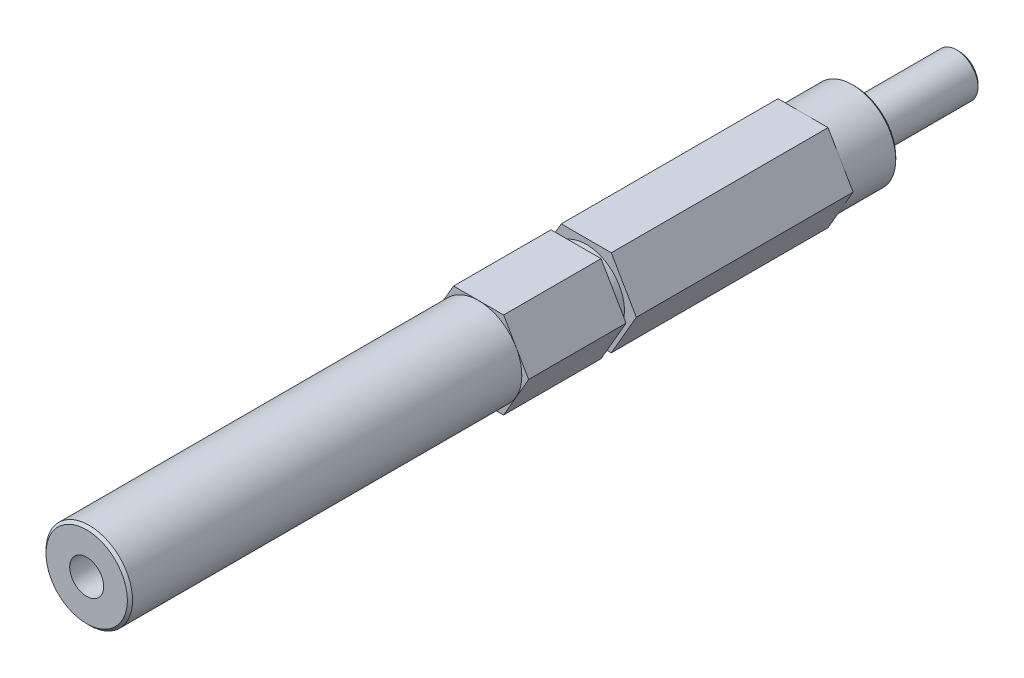
ISO-10303-21;
HEADER;
FILE_DESCRIPTION(('STEP AP214'),'2;1');
FILE_NAME('part.step','',(''),(''),'','','');
FILE_SCHEMA(('AUTOMOTIVE_DESIGN { 1 0 10303 214 1 1 1 1 }'));
ENDSEC;
DATA;
#1=APPLICATION_CONTEXT('core data for automotive mechanical design processes');
#2=APPLICATION_PROTOCOL_DEFINITION('international standard','automotive_design',2000,#1);
#3=PRODUCT_CONTEXT('',#1,'mechanical');
#4=PRODUCT('Part','Part','',(#3));
#5=PRODUCT_RELATED_PRODUCT_CATEGORY('part','',(#4));
#6=PRODUCT_DEFINITION_FORMATION('','',#4);
#7=PRODUCT_DEFINITION_CONTEXT('part definition',#1,'design');
#8=PRODUCT_DEFINITION('design','',#6,#7);
#9=PRODUCT_DEFINITION_SHAPE('','',#8);
#10=(LENGTH_UNIT() NAMED_UNIT(*) SI_UNIT(.MILLI.,.METRE.));
#11=(NAMED_UNIT(*) PLANE_ANGLE_UNIT() SI_UNIT($,.RADIAN.));
#12=(NAMED_UNIT(*) SI_UNIT($,.STERADIAN.) SOLID_ANGLE_UNIT());
#13=UNCERTAINTY_MEASURE_WITH_UNIT(LENGTH_MEASURE(1.E-05),#10,'distance_accuracy_value','');
#14=(GEOMETRIC_REPRESENTATION_CONTEXT(3) GLOBAL_UNCERTAINTY_ASSIGNED_CONTEXT((#13)) GLOBAL_UNIT_ASSIGNED_CONTEXT((#10,
#11,#12)) REPRESENTATION_CONTEXT('',''));
#15=CARTESIAN_POINT('',(0.,0.,0.));
#16=DIRECTION('',(0.,0.,1.));
#17=DIRECTION('',(1.,0.,0.));
#18=AXIS2_PLACEMENT_3D('',#15,#16,#17);
#19=CARTESIAN_POINT('',(9.05330995064486,0.,-22.86));
#20=DIRECTION('',(0.,0.,1.));
#21=DIRECTION('',(1.,0.,0.));
#22=AXIS2_PLACEMENT_3D('',#19,#20,#21);
#23=PLANE('',#22);
#24=CARTESIAN_POINT('',(9.05330995064486,0.,-22.860000000037));
#25=DIRECTION('',(0.,0.,1.));
#26=DIRECTION('',(1.,0.,0.));
#27=AXIS2_PLACEMENT_3D('',#24,#25,#26);
#28=CIRCLE('',#27,2.76859999993877);
#29=CARTESIAN_POINT('',(11.8219099505836,0.,-22.860000000037));
#30=VERTEX_POINT('',#29);
#31=EDGE_CURVE('E20',#30,#30,#28,.T.);
#32=ORIENTED_EDGE('',*,*,#31,.F.);
#33=EDGE_LOOP('',(#32));
#34=FACE_BOUND('',#33,.T.);
#35=ADVANCED_FACE('F17',(#34),#23,.F.);
#36=CARTESIAN_POINT('',(9.05330995064486,0.,-22.4790000000326));
#37=DIRECTION('',(0.,0.,1.));
#38=DIRECTION('',(1.,0.,0.));
#39=AXIS2_PLACEMENT_3D('',#36,#37,#38);
#40=CONICAL_SURFACE('',#39,3.14959999994318,0.785398163397448);
#41=CARTESIAN_POINT('',(9.05330995064486,0.,-22.479));
#42=DIRECTION('',(0.,0.,-1.));
#43=DIRECTION('',(-1.,0.,0.));
#44=AXIS2_PLACEMENT_3D('',#41,#42,#43);
#45=CIRCLE('',#44,3.1496);
#46=CARTESIAN_POINT('',(5.90370995064486,0.,-22.479));
#47=VERTEX_POINT('',#46);
#48=EDGE_CURVE('E159',#47,#47,#45,.F.);
#49=ORIENTED_EDGE('',*,*,#48,.F.);
#50=EDGE_LOOP('',(#49));
#51=FACE_BOUND('',#50,.T.);
#52=ORIENTED_EDGE('',*,*,#31,.T.);
#53=EDGE_LOOP('',(#52));
#54=FACE_BOUND('',#53,.T.);
#55=ADVANCED_FACE('F353',(#51,#54),#40,.T.);
#56=CARTESIAN_POINT('',(9.05330995064486,0.,-22.86));
#57=DIRECTION('',(0.,0.,-1.));
#58=DIRECTION('',(-1.,0.,0.));
#59=AXIS2_PLACEMENT_3D('',#56,#57,#58);
#60=CYLINDRICAL_SURFACE('',#59,3.1496);
#61=CARTESIAN_POINT('',(9.05330995064486,0.,-7.62));
#62=DIRECTION('',(0.,0.,-1.));
#63=DIRECTION('',(-1.,0.,0.));
#64=AXIS2_PLACEMENT_3D('',#61,#62,#63);
#65=CIRCLE('',#64,3.1496);
#66=CARTESIAN_POINT('',(5.90370995064486,0.,-7.62));
#67=VERTEX_POINT('',#66);
#68=EDGE_CURVE('E162',#67,#67,#65,.T.);
#69=ORIENTED_EDGE('',*,*,#68,.T.);
#70=EDGE_LOOP('',(#69));
#71=FACE_BOUND('',#70,.T.);
#72=ORIENTED_EDGE('',*,*,#48,.T.);
#73=EDGE_LOOP('',(#72));
#74=FACE_BOUND('',#73,.T.);
#75=ADVANCED_FACE('F338',(#71,#74),#60,.T.);
#76=CARTESIAN_POINT('',(9.05330995064486,0.,-7.62));
#77=DIRECTION('',(0.,0.,1.));
#78=DIRECTION('',(1.,0.,0.));
#79=AXIS2_PLACEMENT_3D('',#76,#77,#78);
#80=PLANE('',#79);
#81=CARTESIAN_POINT('',(9.05330995064486,0.,-7.61999999997443));
#82=DIRECTION('',(0.,0.,1.));
#83=DIRECTION('',(1.,0.,0.));
#84=AXIS2_PLACEMENT_3D('',#81,#82,#83);
#85=CIRCLE('',#84,5.96264999998613);
#86=CARTESIAN_POINT('',(15.015959950631,0.,-7.61999999997443));
#87=VERTEX_POINT('',#86);
#88=EDGE_CURVE('E156',#87,#87,#85,.T.);
#89=ORIENTED_EDGE('',*,*,#88,.F.);
#90=EDGE_LOOP('',(#89));
#91=FACE_BOUND('',#90,.T.);
#92=ORIENTED_EDGE('',*,*,#68,.F.);
#93=EDGE_LOOP('',(#92));
#94=FACE_BOUND('',#93,.T.);
#95=ADVANCED_FACE('F341',(#91,#94),#80,.F.);
#96=CARTESIAN_POINT('',(9.05330995064486,0.,-7.23899999997002));
#97=DIRECTION('',(0.,0.,1.));
#98=DIRECTION('',(1.,0.,0.));
#99=AXIS2_PLACEMENT_3D('',#96,#97,#98);
#100=CONICAL_SURFACE('',#99,6.34364999999053,0.785398163397448);
#101=CARTESIAN_POINT('',(9.05330995064486,0.,-7.239));
#102=DIRECTION('',(0.,0.,-1.));
#103=DIRECTION('',(-1.,0.,0.));
#104=AXIS2_PLACEMENT_3D('',#101,#102,#103);
#105=CIRCLE('',#104,6.34365);
#106=CARTESIAN_POINT('',(2.70965995064486,0.,-7.239));
#107=VERTEX_POINT('',#106);
#108=EDGE_CURVE('E153',#107,#107,#105,.F.);
#109=ORIENTED_EDGE('',*,*,#108,.F.);
#110=EDGE_LOOP('',(#109));
#111=FACE_BOUND('',#110,.T.);
#112=ORIENTED_EDGE('',*,*,#88,.T.);
#113=EDGE_LOOP('',(#112));
#114=FACE_BOUND('',#113,.T.);
#115=ADVANCED_FACE('F343',(#111,#114),#100,.T.);
#116=CARTESIAN_POINT('',(9.05330995064486,0.,-7.62));
#117=DIRECTION('',(0.,0.,-1.));
#118=DIRECTION('',(-1.,0.,0.));
#119=AXIS2_PLACEMENT_3D('',#116,#117,#118);
#120=CYLINDRICAL_SURFACE('',#119,6.34365);
#121=CARTESIAN_POINT('',(9.05330995064486,0.,0.));
#122=DIRECTION('',(0.,0.,-1.));
#123=DIRECTION('',(-1.,0.,0.));
#124=AXIS2_PLACEMENT_3D('',#121,#122,#123);
#125=CIRCLE('',#124,6.34365);
#126=CARTESIAN_POINT('',(2.70965995064486,0.,0.));
#127=VERTEX_POINT('',#126);
#128=EDGE_CURVE('E135',#127,#127,#125,.T.);
#129=ORIENTED_EDGE('',*,*,#128,.T.);
#130=EDGE_LOOP('',(#129));
#131=FACE_BOUND('',#130,.T.);
#132=ORIENTED_EDGE('',*,*,#108,.T.);
#133=EDGE_LOOP('',(#132));
#134=FACE_BOUND('',#133,.T.);
#135=ADVANCED_FACE('F350',(#131,#134),#120,.T.);
#136=CARTESIAN_POINT('',(12.719484159999,6.35,0.));
#137=DIRECTION('',(0.,0.,1.));
#138=DIRECTION('',(1.,0.,0.));
#139=AXIS2_PLACEMENT_3D('',#136,#137,#138);
#140=PLANE('',#139);
#141=DIRECTION('',(-0.499999999999999,-0.866025403784439,0.));
#142=VECTOR('',#141,1.);
#143=CARTESIAN_POINT('',(12.719484159999,-6.35000000000001,0.));
#144=LINE('',#143,#142);
#145=CARTESIAN_POINT('',(16.3856583693531,0.,0.));
#146=VERTEX_POINT('',#145);
#147=CARTESIAN_POINT('',(12.719484159999,-6.35000000000001,0.));
#148=VERTEX_POINT('',#147);
#149=EDGE_CURVE('E124',#146,#148,#144,.T.);
#150=ORIENTED_EDGE('',*,*,#149,.T.);
#151=DIRECTION('',(1.,0.,0.));
#152=VECTOR('',#151,1.);
#153=CARTESIAN_POINT('',(5.38713574129074,-6.35000000000001,0.));
#154=LINE('',#153,#152);
#155=CARTESIAN_POINT('',(5.38713574129074,-6.35000000000001,0.));
#156=VERTEX_POINT('',#155);
#157=EDGE_CURVE('E144',#148,#156,#154,.F.);
#158=ORIENTED_EDGE('',*,*,#157,.T.);
#159=DIRECTION('',(-0.499999999999999,0.866025403784439,0.));
#160=VECTOR('',#159,1.);
#161=CARTESIAN_POINT('',(1.72096153193662,0.,0.));
#162=LINE('',#161,#160);
#163=CARTESIAN_POINT('',(1.72096153193662,0.,0.));
#164=VERTEX_POINT('',#163);
#165=EDGE_CURVE('E297',#156,#164,#162,.T.);
#166=ORIENTED_EDGE('',*,*,#165,.T.);
#167=DIRECTION('',(0.499999999999999,0.866025403784439,0.));
#168=VECTOR('',#167,1.);
#169=CARTESIAN_POINT('',(5.38713574129074,6.34999999999999,0.));
#170=LINE('',#169,#168);
#171=CARTESIAN_POINT('',(5.38713574129074,6.35,0.));
#172=VERTEX_POINT('',#171);
#173=EDGE_CURVE('E292',#164,#172,#170,.T.);
#174=ORIENTED_EDGE('',*,*,#173,.T.);
#175=DIRECTION('',(1.,0.,0.));
#176=VECTOR('',#175,1.);
#177=CARTESIAN_POINT('',(12.719484159999,6.35,0.));
#178=LINE('',#177,#176);
#179=CARTESIAN_POINT('',(12.719484159999,6.35,0.));
#180=VERTEX_POINT('',#179);
#181=EDGE_CURVE('E132',#172,#180,#178,.T.);
#182=ORIENTED_EDGE('',*,*,#181,.T.);
#183=DIRECTION('',(0.499999999999999,-0.866025403784439,0.));
#184=VECTOR('',#183,1.);
#185=CARTESIAN_POINT('',(16.3856583693531,0.,0.));
#186=LINE('',#185,#184);
#187=EDGE_CURVE('E127',#180,#146,#186,.T.);
#188=ORIENTED_EDGE('',*,*,#187,.T.);
#189=EDGE_LOOP('',(#150,#158,#166,#174,#182,#188));
#190=FACE_BOUND('',#189,.T.);
#191=ORIENTED_EDGE('',*,*,#128,.F.);
#192=EDGE_LOOP('',(#191));
#193=FACE_BOUND('',#192,.T.);
#194=ADVANCED_FACE('F129',(#190,#193),#140,.F.);
#195=CARTESIAN_POINT('',(16.3856583693531,0.,47.5234));
#196=DIRECTION('',(-0.866025403784439,-0.499999999999999,0.));
#197=DIRECTION('',(0.499999999999999,-0.866025403784439,0.));
#198=AXIS2_PLACEMENT_3D('',#195,#196,#197);
#199=PLANE('',#198);
#200=DIRECTION('',(0.499999999999998,-0.86602540378444,0.));
#201=VECTOR('',#200,1.);
#202=CARTESIAN_POINT('',(12.719484159999,6.35,31.75));
#203=LINE('',#202,#201);
#204=CARTESIAN_POINT('',(12.719484159999,6.34999999999999,31.75));
#205=VERTEX_POINT('',#204);
#206=CARTESIAN_POINT('',(16.3856583693531,0.,31.75));
#207=VERTEX_POINT('',#206);
#208=EDGE_CURVE('E141',#205,#207,#203,.T.);
#209=ORIENTED_EDGE('',*,*,#208,.T.);
#210=DIRECTION('',(0.,0.,1.));
#211=VECTOR('',#210,1.);
#212=CARTESIAN_POINT('',(16.3856583693531,0.,47.5234));
#213=LINE('',#212,#211);
#214=EDGE_CURVE('E138',#207,#146,#213,.F.);
#215=ORIENTED_EDGE('',*,*,#214,.T.);
#216=ORIENTED_EDGE('',*,*,#187,.F.);
#217=DIRECTION('',(0.,0.,1.));
#218=VECTOR('',#217,1.);
#219=CARTESIAN_POINT('',(12.719484159999,6.35,47.5234));
#220=LINE('',#219,#218);
#221=EDGE_CURVE('E286',#180,#205,#220,.T.);
#222=ORIENTED_EDGE('',*,*,#221,.T.);
#223=EDGE_LOOP('',(#209,#215,#216,#222));
#224=FACE_BOUND('',#223,.T.);
#225=ADVANCED_FACE('F139',(#224),#199,.F.);
#226=CARTESIAN_POINT('',(12.719484159999,-6.35000000000001,47.5234));
#227=DIRECTION('',(-0.866025403784439,0.499999999999999,0.));
#228=DIRECTION('',(-0.499999999999999,-0.866025403784439,0.));
#229=AXIS2_PLACEMENT_3D('',#226,#227,#228);
#230=PLANE('',#229);
#231=DIRECTION('',(-0.499999999999996,-0.86602540378444,0.));
#232=VECTOR('',#231,1.);
#233=CARTESIAN_POINT('',(16.3856583693531,0.,31.75));
#234=LINE('',#233,#232);
#235=CARTESIAN_POINT('',(12.719484159999,-6.35000000000001,31.75));
#236=VERTEX_POINT('',#235);
#237=EDGE_CURVE('E280',#207,#236,#234,.T.);
#238=ORIENTED_EDGE('',*,*,#237,.T.);
#239=DIRECTION('',(0.,0.,1.));
#240=VECTOR('',#239,1.);
#241=CARTESIAN_POINT('',(12.719484159999,-6.35000000000001,47.5234));
#242=LINE('',#241,#240);
#243=EDGE_CURVE('E148',#236,#148,#242,.F.);
#244=ORIENTED_EDGE('',*,*,#243,.T.);
#245=ORIENTED_EDGE('',*,*,#149,.F.);
#246=ORIENTED_EDGE('',*,*,#214,.F.);
#247=EDGE_LOOP('',(#238,#244,#245,#246));
#248=FACE_BOUND('',#247,.T.);
#249=ADVANCED_FACE('F146',(#248),#230,.F.);
#250=CARTESIAN_POINT('',(5.38713574129074,-6.35000000000001,47.5234));
#251=DIRECTION('',(0.,1.,0.));
#252=DIRECTION('',(0.,0.,1.));
#253=AXIS2_PLACEMENT_3D('',#250,#251,#252);
#254=PLANE('',#253);
#255=DIRECTION('',(-1.,0.,0.));
#256=VECTOR('',#255,1.);
#257=CARTESIAN_POINT('',(40.0413099506449,-6.35000000000001,31.75));
#258=LINE('',#257,#256);
#259=CARTESIAN_POINT('',(5.38713574129074,-6.35000000000001,31.75));
#260=VERTEX_POINT('',#259);
#261=EDGE_CURVE('E278',#236,#260,#258,.T.);
#262=ORIENTED_EDGE('',*,*,#261,.T.);
#263=DIRECTION('',(0.,0.,1.));
#264=VECTOR('',#263,1.);
#265=CARTESIAN_POINT('',(5.38713574129074,-6.35000000000001,47.5234));
#266=LINE('',#265,#264);
#267=EDGE_CURVE('E294',#260,#156,#266,.F.);
#268=ORIENTED_EDGE('',*,*,#267,.T.);
#269=ORIENTED_EDGE('',*,*,#157,.F.);
#270=ORIENTED_EDGE('',*,*,#243,.F.);
#271=EDGE_LOOP('',(#262,#268,#269,#270));
#272=FACE_BOUND('',#271,.T.);
#273=ADVANCED_FACE('F302',(#272),#254,.F.);
#274=CARTESIAN_POINT('',(1.72096153193662,0.,47.5234));
#275=DIRECTION('',(0.866025403784439,0.499999999999999,0.));
#276=DIRECTION('',(-0.499999999999999,0.866025403784439,0.));
#277=AXIS2_PLACEMENT_3D('',#274,#275,#276);
#278=PLANE('',#277);
#279=DIRECTION('',(-0.499999999999999,0.866025403784439,0.));
#280=VECTOR('',#279,1.);
#281=CARTESIAN_POINT('',(5.38713574129074,-6.35000000000001,31.75));
#282=LINE('',#281,#280);
#283=CARTESIAN_POINT('',(1.72096153193662,0.,31.75));
#284=VERTEX_POINT('',#283);
#285=EDGE_CURVE('E276',#260,#284,#282,.T.);
#286=ORIENTED_EDGE('',*,*,#285,.T.);
#287=DIRECTION('',(0.,0.,1.));
#288=VECTOR('',#287,1.);
#289=CARTESIAN_POINT('',(1.72096153193662,0.,47.5234));
#290=LINE('',#289,#288);
#291=EDGE_CURVE('E289',#284,#164,#290,.F.);
#292=ORIENTED_EDGE('',*,*,#291,.T.);
#293=ORIENTED_EDGE('',*,*,#165,.F.);
#294=ORIENTED_EDGE('',*,*,#267,.F.);
#295=EDGE_LOOP('',(#286,#292,#293,#294));
#296=FACE_BOUND('',#295,.T.);
#297=ADVANCED_FACE('F306',(#296),#278,.F.);
#298=CARTESIAN_POINT('',(5.38713574129074,6.34999999999999,47.5234));
#299=DIRECTION('',(0.866025403784439,-0.499999999999999,0.));
#300=DIRECTION('',(0.499999999999999,0.866025403784439,0.));
#301=AXIS2_PLACEMENT_3D('',#298,#299,#300);
#302=PLANE('',#301);
#303=DIRECTION('',(0.5,0.866025403784439,0.));
#304=VECTOR('',#303,1.);
#305=CARTESIAN_POINT('',(1.72096153193662,0.,31.75));
#306=LINE('',#305,#304);
#307=CARTESIAN_POINT('',(5.38713574129074,6.34999999999999,31.75));
#308=VERTEX_POINT('',#307);
#309=EDGE_CURVE('E274',#284,#308,#306,.T.);
#310=ORIENTED_EDGE('',*,*,#309,.T.);
#311=DIRECTION('',(0.,0.,1.));
#312=VECTOR('',#311,1.);
#313=CARTESIAN_POINT('',(5.38713574129074,6.35,47.5234));
#314=LINE('',#313,#312);
#315=EDGE_CURVE('E283',#308,#172,#314,.F.);
#316=ORIENTED_EDGE('',*,*,#315,.T.);
#317=ORIENTED_EDGE('',*,*,#173,.F.);
#318=ORIENTED_EDGE('',*,*,#291,.F.);
#319=EDGE_LOOP('',(#310,#316,#317,#318));
#320=FACE_BOUND('',#319,.T.);
#321=ADVANCED_FACE('F311',(#320),#302,.F.);
#322=CARTESIAN_POINT('',(12.719484159999,6.35,47.5234));
#323=DIRECTION('',(0.,-1.,0.));
#324=DIRECTION('',(1.,0.,0.));
#325=AXIS2_PLACEMENT_3D('',#322,#323,#324);
#326=PLANE('',#325);
#327=DIRECTION('',(-1.,0.,0.));
#328=VECTOR('',#327,1.);
#329=CARTESIAN_POINT('',(40.0413099506449,6.34999999999999,31.75));
#330=LINE('',#329,#328);
#331=EDGE_CURVE('E270',#308,#205,#330,.F.);
#332=ORIENTED_EDGE('',*,*,#331,.T.);
#333=ORIENTED_EDGE('',*,*,#221,.F.);
#334=ORIENTED_EDGE('',*,*,#181,.F.);
#335=ORIENTED_EDGE('',*,*,#315,.F.);
#336=EDGE_LOOP('',(#332,#333,#334,#335));
#337=FACE_BOUND('',#336,.T.);
#338=ADVANCED_FACE('F315',(#337),#326,.F.);
#339=CARTESIAN_POINT('',(40.0413099506449,0.,31.75));
#340=DIRECTION('',(0.,0.,-1.));
#341=DIRECTION('',(-1.,0.,0.));
#342=AXIS2_PLACEMENT_3D('',#339,#340,#341);
#343=PLANE('',#342);
#344=ORIENTED_EDGE('',*,*,#309,.F.);
#345=ORIENTED_EDGE('',*,*,#285,.F.);
#346=ORIENTED_EDGE('',*,*,#261,.F.);
#347=ORIENTED_EDGE('',*,*,#237,.F.);
#348=ORIENTED_EDGE('',*,*,#208,.F.);
#349=ORIENTED_EDGE('',*,*,#331,.F.);
#350=EDGE_LOOP('',(#344,#345,#346,#347,#348,#349));
#351=FACE_BOUND('',#350,.T.);
#352=CARTESIAN_POINT('',(9.05330995064486,0.,31.75));
#353=DIRECTION('',(0.,0.,-1.));
#354=DIRECTION('',(-1.,0.,0.));
#355=AXIS2_PLACEMENT_3D('',#352,#353,#354);
#356=CIRCLE('',#355,5.588);
#357=CARTESIAN_POINT('',(3.46530995064486,0.,31.75));
#358=VERTEX_POINT('',#357);
#359=EDGE_CURVE('E273',#358,#358,#356,.F.);
#360=ORIENTED_EDGE('',*,*,#359,.F.);
#361=EDGE_LOOP('',(#360));
#362=FACE_BOUND('',#361,.T.);
#363=ADVANCED_FACE('F317',(#351,#362),#343,.F.);
#364=CARTESIAN_POINT('',(9.05330995064486,0.,89.0524));
#365=DIRECTION('',(0.,0.,-1.));
#366=DIRECTION('',(-1.,0.,0.));
#367=AXIS2_PLACEMENT_3D('',#364,#365,#366);
#368=PLANE('',#367);
#369=CARTESIAN_POINT('',(9.05330995064486,0.,89.0524));
#370=DIRECTION('',(0.,0.,1.));
#371=DIRECTION('',(1.,0.,0.));
#372=AXIS2_PLACEMENT_3D('',#369,#370,#371);
#373=CIRCLE('',#372,2.48793);
#374=CARTESIAN_POINT('',(11.5412399506449,0.,89.0524));
#375=VERTEX_POINT('',#374);
#376=EDGE_CURVE('E325',#375,#375,#373,.T.);
#377=ORIENTED_EDGE('',*,*,#376,.T.);
#378=EDGE_LOOP('',(#377));
#379=FACE_BOUND('',#378,.T.);
#380=ADVANCED_FACE('F320',(#379),#368,.F.);
#381=CARTESIAN_POINT('',(9.05330995064486,0.,-7.62));
#382=DIRECTION('',(0.,0.,-1.));
#383=DIRECTION('',(-1.,0.,0.));
#384=AXIS2_PLACEMENT_3D('',#381,#382,#383);
#385=CYLINDRICAL_SURFACE('',#384,5.588);
#386=ORIENTED_EDGE('',*,*,#359,.T.);
#387=EDGE_LOOP('',(#386));
#388=FACE_BOUND('',#387,.T.);
#389=CARTESIAN_POINT('',(9.05330995064486,0.,33.2486));
#390=DIRECTION('',(0.,0.,-1.));
#391=DIRECTION('',(-1.,0.,0.));
#392=AXIS2_PLACEMENT_3D('',#389,#390,#391);
#393=CIRCLE('',#392,5.588);
#394=CARTESIAN_POINT('',(3.46530995064486,0.,33.2486));
#395=VERTEX_POINT('',#394);
#396=EDGE_CURVE('E328',#395,#395,#393,.T.);
#397=ORIENTED_EDGE('',*,*,#396,.T.);
#398=EDGE_LOOP('',(#397));
#399=FACE_BOUND('',#398,.T.);
#400=ADVANCED_FACE('F445',(#388,#399),#385,.T.);
#401=CARTESIAN_POINT('',(9.05330995064486,0.,104.9274));
#402=DIRECTION('',(0.,0.,1.));
#403=DIRECTION('',(1.,0.,0.));
#404=AXIS2_PLACEMENT_3D('',#401,#402,#403);
#405=CYLINDRICAL_SURFACE('',#404,2.48793);
#406=CARTESIAN_POINT('',(9.05330995064486,0.,104.9274));
#407=DIRECTION('',(0.,0.,1.));
#408=DIRECTION('',(1.,0.,0.));
#409=AXIS2_PLACEMENT_3D('',#406,#407,#408);
#410=CIRCLE('',#409,2.48793);
#411=CARTESIAN_POINT('',(11.5412399506449,0.,104.9274));
#412=VERTEX_POINT('',#411);
#413=EDGE_CURVE('E266',#412,#412,#410,.F.);
#414=ORIENTED_EDGE('',*,*,#413,.F.);
#415=EDGE_LOOP('',(#414));
#416=FACE_BOUND('',#415,.T.);
#417=ORIENTED_EDGE('',*,*,#376,.F.);
#418=EDGE_LOOP('',(#417));
#419=FACE_BOUND('',#418,.T.);
#420=ADVANCED_FACE('F453',(#416,#419),#405,.F.);
#421=CARTESIAN_POINT('',(14.6413099506449,0.,33.2486));
#422=DIRECTION('',(0.,0.,1.));
#423=DIRECTION('',(1.,0.,0.));
#424=AXIS2_PLACEMENT_3D('',#421,#422,#423);
#425=PLANE('',#424);
#426=ORIENTED_EDGE('',*,*,#396,.F.);
#427=EDGE_LOOP('',(#426));
#428=FACE_BOUND('',#427,.T.);
#429=DIRECTION('',(-0.499999999999999,-0.866025403784439,0.));
#430=VECTOR('',#429,1.);
#431=CARTESIAN_POINT('',(12.719484159999,-6.35000000000001,33.2486));
#432=LINE('',#431,#430);
#433=CARTESIAN_POINT('',(16.3856583693531,0.,33.2486));
#434=VERTEX_POINT('',#433);
#435=CARTESIAN_POINT('',(12.719484159999,-6.35000000000001,33.2486));
#436=VERTEX_POINT('',#435);
#437=EDGE_CURVE('E72',#434,#436,#432,.T.);
#438=ORIENTED_EDGE('',*,*,#437,.T.);
#439=DIRECTION('',(1.,0.,0.));
#440=VECTOR('',#439,1.);
#441=CARTESIAN_POINT('',(5.38713574129074,-6.35000000000001,33.2486));
#442=LINE('',#441,#440);
#443=CARTESIAN_POINT('',(5.38713574129074,-6.35000000000001,33.2486));
#444=VERTEX_POINT('',#443);
#445=EDGE_CURVE('E247',#436,#444,#442,.F.);
#446=ORIENTED_EDGE('',*,*,#445,.T.);
#447=DIRECTION('',(-0.499999999999999,0.866025403784439,0.));
#448=VECTOR('',#447,1.);
#449=CARTESIAN_POINT('',(1.72096153193662,0.,33.2486));
#450=LINE('',#449,#448);
#451=CARTESIAN_POINT('',(1.72096153193662,0.,33.2486));
#452=VERTEX_POINT('',#451);
#453=EDGE_CURVE('E252',#444,#452,#450,.T.);
#454=ORIENTED_EDGE('',*,*,#453,.T.);
#455=DIRECTION('',(0.499999999999999,0.866025403784439,0.));
#456=VECTOR('',#455,1.);
#457=CARTESIAN_POINT('',(5.38713574129074,6.34999999999999,33.2486));
#458=LINE('',#457,#456);
#459=CARTESIAN_POINT('',(5.38713574129074,6.35,33.2486));
#460=VERTEX_POINT('',#459);
#461=EDGE_CURVE('E257',#452,#460,#458,.T.);
#462=ORIENTED_EDGE('',*,*,#461,.T.);
#463=DIRECTION('',(1.,0.,0.));
#464=VECTOR('',#463,1.);
#465=CARTESIAN_POINT('',(12.719484159999,6.35,33.2486));
#466=LINE('',#465,#464);
#467=CARTESIAN_POINT('',(12.719484159999,6.35,33.2486));
#468=VERTEX_POINT('',#467);
#469=EDGE_CURVE('E262',#460,#468,#466,.T.);
#470=ORIENTED_EDGE('',*,*,#469,.T.);
#471=DIRECTION('',(0.499999999999999,-0.866025403784439,0.));
#472=VECTOR('',#471,1.);
#473=CARTESIAN_POINT('',(16.3856583693531,0.,33.2486));
#474=LINE('',#473,#472);
#475=EDGE_CURVE('E264',#468,#434,#474,.T.);
#476=ORIENTED_EDGE('',*,*,#475,.T.);
#477=EDGE_LOOP('',(#438,#446,#454,#462,#470,#476));
#478=FACE_BOUND('',#477,.T.);
#479=ADVANCED_FACE('F460',(#428,#478),#425,.F.);
#480=CARTESIAN_POINT('',(9.05330995064486,0.,104.9274));
#481=DIRECTION('',(0.,0.,1.));
#482=DIRECTION('',(1.,0.,0.));
#483=AXIS2_PLACEMENT_3D('',#480,#481,#482);
#484=PLANE('',#483);
#485=CARTESIAN_POINT('',(9.05330995064486,0.,104.927400000008));
#486=DIRECTION('',(0.,0.,-1.));
#487=DIRECTION('',(-1.,0.,0.));
#488=AXIS2_PLACEMENT_3D('',#485,#486,#487);
#489=CIRCLE('',#488,5.95630000000864);
#490=CARTESIAN_POINT('',(3.09700995063622,0.,104.927400000008));
#491=VERTEX_POINT('',#490);
#492=EDGE_CURVE('E239',#491,#491,#489,.T.);
#493=ORIENTED_EDGE('',*,*,#492,.F.);
#494=EDGE_LOOP('',(#493));
#495=FACE_BOUND('',#494,.T.);
#496=ORIENTED_EDGE('',*,*,#413,.T.);
#497=EDGE_LOOP('',(#496));
#498=FACE_BOUND('',#497,.T.);
#499=ADVANCED_FACE('F468',(#495,#498),#484,.T.);
#500=CARTESIAN_POINT('',(9.05330995064485,-4.69900000000001,102.3874));
#501=DIRECTION('',(0.,-1.,0.));
#502=DIRECTION('',(0.,0.,-1.));
#503=AXIS2_PLACEMENT_3D('',#500,#501,#502);
#504=PLANE('',#503);
#505=CARTESIAN_POINT('',(9.05330995064486,-4.69900000000001,59.2074));
#506=DIRECTION('',(0.,1.,0.));
#507=DIRECTION('',(0.,0.,1.));
#508=AXIS2_PLACEMENT_3D('',#505,#506,#507);
#509=CIRCLE('',#508,1.6256);
#510=CARTESIAN_POINT('',(7.42770995064486,-4.69900000000001,59.2074));
#511=VERTEX_POINT('',#510);
#512=CARTESIAN_POINT('',(10.6789099506449,-4.69900000000001,59.2074));
#513=VERTEX_POINT('',#512);
#514=EDGE_CURVE('E229',#511,#513,#509,.F.);
#515=ORIENTED_EDGE('',*,*,#514,.T.);
#516=DIRECTION('',(0.,0.,-1.));
#517=VECTOR('',#516,1.);
#518=CARTESIAN_POINT('',(10.6789099506449,-4.69900000000001,59.2074));
#519=LINE('',#518,#517);
#520=CARTESIAN_POINT('',(10.6789099506449,-4.69900000000001,102.3874));
#521=VERTEX_POINT('',#520);
#522=EDGE_CURVE('E60',#513,#521,#519,.F.);
#523=ORIENTED_EDGE('',*,*,#522,.T.);
#524=CARTESIAN_POINT('',(9.05330995064485,-4.69900000000001,102.3874));
#525=DIRECTION('',(0.,1.,0.));
#526=DIRECTION('',(0.,0.,1.));
#527=AXIS2_PLACEMENT_3D('',#524,#525,#526);
#528=CIRCLE('',#527,1.62560000000001);
#529=CARTESIAN_POINT('',(7.42770995064484,-4.69900000000001,102.3874));
#530=VERTEX_POINT('',#529);
#531=EDGE_CURVE('E63',#521,#530,#528,.F.);
#532=ORIENTED_EDGE('',*,*,#531,.T.);
#533=DIRECTION('',(0.,0.,1.));
#534=VECTOR('',#533,1.);
#535=CARTESIAN_POINT('',(7.42770995064485,-4.69900000000001,102.3874));
#536=LINE('',#535,#534);
#537=EDGE_CURVE('E268',#530,#511,#536,.F.);
#538=ORIENTED_EDGE('',*,*,#537,.T.);
#539=EDGE_LOOP('',(#515,#523,#532,#538));
#540=FACE_BOUND('',#539,.T.);
#541=ADVANCED_FACE('F476',(#540),#504,.T.);
#542=CARTESIAN_POINT('',(16.3856583693531,0.,47.5234));
#543=DIRECTION('',(-0.866025403784439,-0.499999999999999,0.));
#544=DIRECTION('',(0.499999999999999,-0.866025403784439,0.));
#545=AXIS2_PLACEMENT_3D('',#542,#543,#544);
#546=PLANE('',#545);
#547=ORIENTED_EDGE('',*,*,#475,.F.);
#548=DIRECTION('',(0.,0.,1.));
#549=VECTOR('',#548,1.);
#550=CARTESIAN_POINT('',(12.719484159999,6.35,47.5234));
#551=LINE('',#550,#549);
#552=CARTESIAN_POINT('',(12.719484159999,6.34999999999999,47.5234));
#553=VERTEX_POINT('',#552);
#554=EDGE_CURVE('E259',#468,#553,#551,.T.);
#555=ORIENTED_EDGE('',*,*,#554,.T.);
#556=DIRECTION('',(-0.499999999999997,0.86602540378444,0.));
#557=VECTOR('',#556,1.);
#558=CARTESIAN_POINT('',(16.3856583693531,0.,47.5234));
#559=LINE('',#558,#557);
#560=CARTESIAN_POINT('',(16.3856583693531,0.,47.5234));
#561=VERTEX_POINT('',#560);
#562=EDGE_CURVE('E226',#561,#553,#559,.T.);
#563=ORIENTED_EDGE('',*,*,#562,.F.);
#564=DIRECTION('',(0.,0.,1.));
#565=VECTOR('',#564,1.);
#566=CARTESIAN_POINT('',(16.3856583693531,0.,47.5234));
#567=LINE('',#566,#565);
#568=EDGE_CURVE('E241',#561,#434,#567,.F.);
#569=ORIENTED_EDGE('',*,*,#568,.T.);
#570=EDGE_LOOP('',(#547,#555,#563,#569));
#571=FACE_BOUND('',#570,.T.);
#572=ADVANCED_FACE('F484',(#571),#546,.F.);
#573=CARTESIAN_POINT('',(12.719484159999,6.35,47.5234));
#574=DIRECTION('',(0.,-1.,0.));
#575=DIRECTION('',(1.,0.,0.));
#576=AXIS2_PLACEMENT_3D('',#573,#574,#575);
#577=PLANE('',#576);
#578=ORIENTED_EDGE('',*,*,#469,.F.);
#579=DIRECTION('',(0.,0.,1.));
#580=VECTOR('',#579,1.);
#581=CARTESIAN_POINT('',(5.38713574129074,6.34999999999999,47.5234));
#582=LINE('',#581,#580);
#583=CARTESIAN_POINT('',(5.38713574129074,6.35,47.5234));
#584=VERTEX_POINT('',#583);
#585=EDGE_CURVE('E254',#460,#584,#582,.T.);
#586=ORIENTED_EDGE('',*,*,#585,.T.);
#587=DIRECTION('',(1.,0.,0.));
#588=VECTOR('',#587,1.);
#589=CARTESIAN_POINT('',(12.719484159999,6.35,47.5234));
#590=LINE('',#589,#588);
#591=EDGE_CURVE('E223',#553,#584,#590,.F.);
#592=ORIENTED_EDGE('',*,*,#591,.F.);
#593=ORIENTED_EDGE('',*,*,#554,.F.);
#594=EDGE_LOOP('',(#578,#586,#592,#593));
#595=FACE_BOUND('',#594,.T.);
#596=ADVANCED_FACE('F491',(#595),#577,.F.);
#597=CARTESIAN_POINT('',(5.38713574129074,6.34999999999999,47.5234));
#598=DIRECTION('',(0.866025403784439,-0.499999999999999,0.));
#599=DIRECTION('',(0.499999999999999,0.866025403784439,0.));
#600=AXIS2_PLACEMENT_3D('',#597,#598,#599);
#601=PLANE('',#600);
#602=ORIENTED_EDGE('',*,*,#461,.F.);
#603=DIRECTION('',(0.,0.,1.));
#604=VECTOR('',#603,1.);
#605=CARTESIAN_POINT('',(1.72096153193662,0.,47.5234));
#606=LINE('',#605,#604);
#607=CARTESIAN_POINT('',(1.72096153193662,0.,47.5234));
#608=VERTEX_POINT('',#607);
#609=EDGE_CURVE('E249',#452,#608,#606,.T.);
#610=ORIENTED_EDGE('',*,*,#609,.T.);
#611=DIRECTION('',(-0.5,-0.866025403784439,0.));
#612=VECTOR('',#611,1.);
#613=CARTESIAN_POINT('',(5.38713574129074,6.34999999999999,47.5234));
#614=LINE('',#613,#612);
#615=EDGE_CURVE('E218',#584,#608,#614,.T.);
#616=ORIENTED_EDGE('',*,*,#615,.F.);
#617=ORIENTED_EDGE('',*,*,#585,.F.);
#618=EDGE_LOOP('',(#602,#610,#616,#617));
#619=FACE_BOUND('',#618,.T.);
#620=ADVANCED_FACE('F499',(#619),#601,.F.);
#621=CARTESIAN_POINT('',(1.72096153193662,0.,47.5234));
#622=DIRECTION('',(0.866025403784439,0.499999999999999,0.));
#623=DIRECTION('',(-0.499999999999999,0.866025403784439,0.));
#624=AXIS2_PLACEMENT_3D('',#621,#622,#623);
#625=PLANE('',#624);
#626=ORIENTED_EDGE('',*,*,#453,.F.);
#627=DIRECTION('',(0.,0.,1.));
#628=VECTOR('',#627,1.);
#629=CARTESIAN_POINT('',(5.38713574129074,-6.35000000000001,47.5234));
#630=LINE('',#629,#628);
#631=CARTESIAN_POINT('',(5.38713574129074,-6.35000000000001,47.5234));
#632=VERTEX_POINT('',#631);
#633=EDGE_CURVE('E244',#444,#632,#630,.T.);
#634=ORIENTED_EDGE('',*,*,#633,.T.);
#635=DIRECTION('',(0.499999999999999,-0.866025403784439,0.));
#636=VECTOR('',#635,1.);
#637=CARTESIAN_POINT('',(1.72096153193662,0.,47.5234));
#638=LINE('',#637,#636);
#639=EDGE_CURVE('E210',#608,#632,#638,.T.);
#640=ORIENTED_EDGE('',*,*,#639,.F.);
#641=ORIENTED_EDGE('',*,*,#609,.F.);
#642=EDGE_LOOP('',(#626,#634,#640,#641));
#643=FACE_BOUND('',#642,.T.);
#644=ADVANCED_FACE('F507',(#643),#625,.F.);
#645=CARTESIAN_POINT('',(5.38713574129074,-6.35000000000001,47.5234));
#646=DIRECTION('',(0.,1.,0.));
#647=DIRECTION('',(0.,0.,1.));
#648=AXIS2_PLACEMENT_3D('',#645,#646,#647);
#649=PLANE('',#648);
#650=ORIENTED_EDGE('',*,*,#445,.F.);
#651=DIRECTION('',(0.,0.,1.));
#652=VECTOR('',#651,1.);
#653=CARTESIAN_POINT('',(12.719484159999,-6.35000000000001,47.5234));
#654=LINE('',#653,#652);
#655=CARTESIAN_POINT('',(12.719484159999,-6.35000000000001,47.5234));
#656=VERTEX_POINT('',#655);
#657=EDGE_CURVE('E237',#436,#656,#654,.T.);
#658=ORIENTED_EDGE('',*,*,#657,.T.);
#659=DIRECTION('',(1.,0.,0.));
#660=VECTOR('',#659,1.);
#661=CARTESIAN_POINT('',(12.719484159999,-6.35000000000001,47.5234));
#662=LINE('',#661,#660);
#663=EDGE_CURVE('E203',#632,#656,#662,.T.);
#664=ORIENTED_EDGE('',*,*,#663,.F.);
#665=ORIENTED_EDGE('',*,*,#633,.F.);
#666=EDGE_LOOP('',(#650,#658,#664,#665));
#667=FACE_BOUND('',#666,.T.);
#668=ADVANCED_FACE('F515',(#667),#649,.F.);
#669=CARTESIAN_POINT('',(12.719484159999,-6.35000000000001,47.5234));
#670=DIRECTION('',(-0.866025403784439,0.499999999999999,0.));
#671=DIRECTION('',(-0.499999999999999,-0.866025403784439,0.));
#672=AXIS2_PLACEMENT_3D('',#669,#670,#671);
#673=PLANE('',#672);
#674=ORIENTED_EDGE('',*,*,#437,.F.);
#675=ORIENTED_EDGE('',*,*,#568,.F.);
#676=DIRECTION('',(0.499999999999997,0.86602540378444,0.));
#677=VECTOR('',#676,1.);
#678=CARTESIAN_POINT('',(12.719484159999,-6.35000000000001,47.5234));
#679=LINE('',#678,#677);
#680=EDGE_CURVE('E206',#656,#561,#679,.T.);
#681=ORIENTED_EDGE('',*,*,#680,.F.);
#682=ORIENTED_EDGE('',*,*,#657,.F.);
#683=EDGE_LOOP('',(#674,#675,#681,#682));
#684=FACE_BOUND('',#683,.T.);
#685=ADVANCED_FACE('F523',(#684),#673,.F.);
#686=CARTESIAN_POINT('',(9.05330995064486,0.,104.546400000061));
#687=DIRECTION('',(0.,0.,-1.));
#688=DIRECTION('',(-1.,0.,0.));
#689=AXIS2_PLACEMENT_3D('',#686,#687,#688);
#690=CONICAL_SURFACE('',#689,6.33729999989936,0.785398163322851);
#691=ORIENTED_EDGE('',*,*,#492,.T.);
#692=EDGE_LOOP('',(#691));
#693=FACE_BOUND('',#692,.T.);
#694=CARTESIAN_POINT('',(9.05330995064486,0.,104.5464));
#695=DIRECTION('',(0.,0.,1.));
#696=DIRECTION('',(1.,0.,0.));
#697=AXIS2_PLACEMENT_3D('',#694,#695,#696);
#698=CIRCLE('',#697,6.3373);
#699=CARTESIAN_POINT('',(15.3906099506449,0.,104.5464));
#700=VERTEX_POINT('',#699);
#701=EDGE_CURVE('E216',#700,#700,#698,.F.);
#702=ORIENTED_EDGE('',*,*,#701,.F.);
#703=EDGE_LOOP('',(#702));
#704=FACE_BOUND('',#703,.T.);
#705=ADVANCED_FACE('F530',(#693,#704),#690,.T.);
#706=CARTESIAN_POINT('',(7.42770995064485,-4.69900000000001,102.3874));
#707=DIRECTION('',(-1.,0.,0.));
#708=DIRECTION('',(0.,0.,1.));
#709=AXIS2_PLACEMENT_3D('',#706,#707,#708);
#710=PLANE('',#709);
#711=ORIENTED_EDGE('',*,*,#537,.F.);
#712=DIRECTION('',(0.,1.,0.));
#713=VECTOR('',#712,1.);
#714=CARTESIAN_POINT('',(7.42770995064484,-4.69900000000001,102.3874));
#715=LINE('',#714,#713);
#716=CARTESIAN_POINT('',(7.42770995064484,-6.12525884595908,102.3874));
#717=VERTEX_POINT('',#716);
#718=EDGE_CURVE('E235',#530,#717,#715,.F.);
#719=ORIENTED_EDGE('',*,*,#718,.T.);
#720=DIRECTION('',(0.,0.,1.));
#721=VECTOR('',#720,1.);
#722=CARTESIAN_POINT('',(7.42770995064486,-6.12525884595908,104.9274));
#723=LINE('',#722,#721);
#724=CARTESIAN_POINT('',(7.42770995064486,-6.12525884595908,59.2074));
#725=VERTEX_POINT('',#724);
#726=EDGE_CURVE('E581',#725,#717,#723,.T.);
#727=ORIENTED_EDGE('',*,*,#726,.F.);
#728=DIRECTION('',(0.,1.,0.));
#729=VECTOR('',#728,1.);
#730=CARTESIAN_POINT('',(7.42770995064486,-4.69900000000001,59.2074));
#731=LINE('',#730,#729);
#732=EDGE_CURVE('E230',#725,#511,#731,.T.);
#733=ORIENTED_EDGE('',*,*,#732,.T.);
#734=EDGE_LOOP('',(#711,#719,#727,#733));
#735=FACE_BOUND('',#734,.T.);
#736=ADVANCED_FACE('F538',(#735),#710,.F.);
#737=CARTESIAN_POINT('',(9.05330995064485,-4.69900000000001,102.3874));
#738=DIRECTION('',(0.,1.,0.));
#739=DIRECTION('',(0.,0.,1.));
#740=AXIS2_PLACEMENT_3D('',#737,#738,#739);
#741=CYLINDRICAL_SURFACE('',#740,1.62560000000001);
#742=ORIENTED_EDGE('',*,*,#531,.F.);
#743=DIRECTION('',(0.,1.,0.));
#744=VECTOR('',#743,1.);
#745=CARTESIAN_POINT('',(10.6789099506449,-4.69900000000001,102.3874));
#746=LINE('',#745,#744);
#747=CARTESIAN_POINT('',(10.6789099506449,-6.12525884595907,102.3874));
#748=VERTEX_POINT('',#747);
#749=EDGE_CURVE('E233',#521,#748,#746,.F.);
#750=ORIENTED_EDGE('',*,*,#749,.T.);
#751=CARTESIAN_POINT('',(7.42770995064484,-6.12525884595908,102.3874));
#752=CARTESIAN_POINT('',(7.427709356923,-6.12525572463596,102.432328133842));
#753=CARTESIAN_POINT('',(7.42957371588238,-6.12575378905719,102.4772339628));
#754=CARTESIAN_POINT('',(7.4370055183865,-6.12772007109261,102.566708965035));
#755=CARTESIAN_POINT('',(7.44257231415087,-6.12918811899767,102.611278195824));
#756=CARTESIAN_POINT('',(7.46474379130429,-6.13498786175214,102.743807686749));
#757=CARTESIAN_POINT('',(7.48681993198254,-6.14071552933311,102.830855929943));
#758=CARTESIAN_POINT('',(7.54484287046004,-6.15522380051766,102.999851394095));
#759=CARTESIAN_POINT('',(7.58078794401057,-6.16400402460014,103.081799247686));
#760=CARTESIAN_POINT('',(7.66548326068623,-6.1836228927604,103.238544919588));
#761=CARTESIAN_POINT('',(7.71423724324487,-6.19446213769246,103.313340641193));
#762=CARTESIAN_POINT('',(7.82435939633125,-6.21725582012846,103.455340355153));
#763=CARTESIAN_POINT('',(7.88596825149969,-6.22922872662577,103.522354683686));
#764=CARTESIAN_POINT('',(8.01953877702431,-6.25278181975898,103.645226869575));
#765=CARTESIAN_POINT('',(8.09150210854133,-6.26436194301189,103.701082933379));
#766=CARTESIAN_POINT('',(8.24504943874145,-6.28603024945513,103.800832977073));
#767=CARTESIAN_POINT('',(8.32675956357822,-6.29609393699625,103.844538585742));
#768=CARTESIAN_POINT('',(8.49666457687721,-6.31338241243553,103.917519367783));
#769=CARTESIAN_POINT('',(8.58485813782846,-6.32060777958045,103.946797485839));
#770=CARTESIAN_POINT('',(8.76323972962669,-6.33127481871246,103.98948154322));
#771=CARTESIAN_POINT('',(8.85334547072325,-6.33479368136509,104.003211755179));
#772=CARTESIAN_POINT('',(9.03464753560265,-6.33792060730356,104.015429135107));
#773=CARTESIAN_POINT('',(9.12584371234741,-6.33752919205503,104.013918335581));
#774=CARTESIAN_POINT('',(9.30448175040245,-6.33293662453739,103.995927340174));
#775=CARTESIAN_POINT('',(9.39196154893374,-6.32882467210693,103.979797617636));
#776=CARTESIAN_POINT('',(9.56292795585902,-6.31735751229113,103.933591256352));
#777=CARTESIAN_POINT('',(9.64641438225139,-6.31000215724055,103.903513982599));
#778=CARTESIAN_POINT('',(9.80793839716156,-6.29273968536095,103.829988139085));
#779=CARTESIAN_POINT('',(9.88591734844571,-6.28280921769043,103.786416461424));
#780=CARTESIAN_POINT('',(10.0335764914472,-6.2614712817308,103.687233205307));
#781=CARTESIAN_POINT('',(10.1032553521581,-6.2500635771618,103.631619699835));
#782=CARTESIAN_POINT('',(10.2344219882629,-6.22662956241333,103.508067286425));
#783=CARTESIAN_POINT('',(10.2956214434947,-6.21459488362776,103.439823575298));
#784=CARTESIAN_POINT('',(10.4057880378981,-6.19155488986381,103.293896656453));
#785=CARTESIAN_POINT('',(10.4547518181978,-6.18054985805612,103.216210865427));
#786=CARTESIAN_POINT('',(10.5392590622104,-6.16078145773521,103.053003771495));
#787=CARTESIAN_POINT('',(10.5747221247797,-6.15203161626909,102.967439182241));
#788=CARTESIAN_POINT('',(10.6306233341289,-6.13793929639438,102.791333089219));
#789=CARTESIAN_POINT('',(10.651083979258,-6.13259171738886,102.700799257645));
#790=CARTESIAN_POINT('',(10.6687705118441,-6.12794233764161,102.572461142469));
#791=CARTESIAN_POINT('',(10.6725733421849,-6.12693765639837,102.535528109705));
#792=CARTESIAN_POINT('',(10.6776402668995,-6.12559616583399,102.461535950612));
#793=CARTESIAN_POINT('',(10.6789084360226,-6.12525828456892,102.424477122759));
#794=CARTESIAN_POINT('',(10.6789099506449,-6.12525884595908,102.3874));
#795=B_SPLINE_CURVE_WITH_KNOTS('',3,(#751,#752,#753,#754,#755,#756,#757,#758,#759,#760,#761,
#762,#763,#764,#765,#766,#767,#768,#769,#770,#771,#772,#773,#774,#775,#776,#777,#778,#779,#780,
#781,#782,#783,#784,#785,#786,#787,#788,#789,#790,#791,#792,#793,#794),.UNSPECIFIED.,.F.,.F.,(4,
2,2,2,2,2,2,2,2,2,2,2,2,2,2,2,2,2,2,2,2,4),(0.,0.134699121579077,0.269374682323243,
0.537937691837068,0.806467323131085,1.07507543625937,1.34925544003829,1.62347947945458,
1.90174385607654,2.1799514147365,2.45224307367208,2.72449842090434,2.99039453821167,
3.25630276245624,3.52471208853495,3.79316439908172,4.06922955289039,4.34537040757636,
4.62313096096354,4.9004741144854,5.01182508212074,5.12299689626736),.UNSPECIFIED.);
#796=EDGE_CURVE('E173',#717,#748,#795,.T.);
#797=ORIENTED_EDGE('',*,*,#796,.F.);
#798=ORIENTED_EDGE('',*,*,#718,.F.);
#799=EDGE_LOOP('',(#742,#750,#797,#798));
#800=FACE_BOUND('',#799,.T.);
#801=ADVANCED_FACE('F546',(#800),#741,.F.);
#802=CARTESIAN_POINT('',(10.6789099506449,-4.69900000000001,59.2074));
#803=DIRECTION('',(1.,0.,0.));
#804=DIRECTION('',(0.,0.,-1.));
#805=AXIS2_PLACEMENT_3D('',#802,#803,#804);
#806=PLANE('',#805);
#807=ORIENTED_EDGE('',*,*,#522,.F.);
#808=DIRECTION('',(0.,1.,0.));
#809=VECTOR('',#808,1.);
#810=CARTESIAN_POINT('',(10.6789099506449,-4.69900000000001,59.2074));
#811=LINE('',#810,#809);
#812=CARTESIAN_POINT('',(10.6789099506449,-6.12525884595908,59.2074));
#813=VERTEX_POINT('',#812);
#814=EDGE_CURVE('E35',#513,#813,#811,.F.);
#815=ORIENTED_EDGE('',*,*,#814,.T.);
#816=DIRECTION('',(0.,0.,1.));
#817=VECTOR('',#816,1.);
#818=CARTESIAN_POINT('',(10.6789099506449,-6.12525884595907,104.9274));
#819=LINE('',#818,#817);
#820=EDGE_CURVE('E172',#748,#813,#819,.F.);
#821=ORIENTED_EDGE('',*,*,#820,.F.);
#822=ORIENTED_EDGE('',*,*,#749,.F.);
#823=EDGE_LOOP('',(#807,#815,#821,#822));
#824=FACE_BOUND('',#823,.T.);
#825=ADVANCED_FACE('F195',(#824),#806,.F.);
#826=CARTESIAN_POINT('',(9.05330995064486,-4.69900000000001,59.2074));
#827=DIRECTION('',(0.,1.,0.));
#828=DIRECTION('',(0.,0.,1.));
#829=AXIS2_PLACEMENT_3D('',#826,#827,#828);
#830=CYLINDRICAL_SURFACE('',#829,1.6256);
#831=ORIENTED_EDGE('',*,*,#514,.F.);
#832=ORIENTED_EDGE('',*,*,#732,.F.);
#833=CARTESIAN_POINT('',(10.6789099506449,-6.12525884595908,59.2074));
#834=CARTESIAN_POINT('',(10.6789105443667,-6.12525572463597,59.1624718661579));
#835=CARTESIAN_POINT('',(10.6770461854073,-6.12575378905719,59.1175660372002));
#836=CARTESIAN_POINT('',(10.6696143829032,-6.12772007109261,59.0280910349654));
#837=CARTESIAN_POINT('',(10.6640475871388,-6.12918811899768,58.9835218041762));
#838=CARTESIAN_POINT('',(10.6418761099854,-6.13498786175214,58.8509923132512));
#839=CARTESIAN_POINT('',(10.6197999693072,-6.14071552933311,58.763944070057));
#840=CARTESIAN_POINT('',(10.5617770308297,-6.15522380051766,58.5949486059051));
#841=CARTESIAN_POINT('',(10.5258319572791,-6.16400402460014,58.5130007523139));
#842=CARTESIAN_POINT('',(10.4411366406035,-6.1836228927604,58.3562550804123));
#843=CARTESIAN_POINT('',(10.3923826580448,-6.19446213769247,58.2814593588075));
#844=CARTESIAN_POINT('',(10.2822605049585,-6.21725582012847,58.1394596448473));
#845=CARTESIAN_POINT('',(10.22065164979,-6.22922872662577,58.0724453163144));
#846=CARTESIAN_POINT('',(10.0870811242654,-6.25278181975898,57.9495731304249));
#847=CARTESIAN_POINT('',(10.0151177927484,-6.26436194301189,57.8937170666208));
#848=CARTESIAN_POINT('',(9.86157046254827,-6.28603024945513,57.7939670229274));
#849=CARTESIAN_POINT('',(9.7798603377115,-6.29609393699625,57.7502614142581));
#850=CARTESIAN_POINT('',(9.60995532441251,-6.31338241243553,57.6772806322174));
#851=CARTESIAN_POINT('',(9.52176176346126,-6.32060777958045,57.6480025141613));
#852=CARTESIAN_POINT('',(9.34338017166303,-6.33127481871246,57.6053184567802));
#853=CARTESIAN_POINT('',(9.25327443056648,-6.33479368136509,57.5915882448207));
#854=CARTESIAN_POINT('',(9.07197236568708,-6.33792060730356,57.579370864893));
#855=CARTESIAN_POINT('',(8.98077618894231,-6.33752919205503,57.5808816644189));
#856=CARTESIAN_POINT('',(8.80213815088728,-6.33293662453739,57.598872659826));
#857=CARTESIAN_POINT('',(8.71465835235599,-6.32882467210693,57.6150023823637));
#858=CARTESIAN_POINT('',(8.54369194543071,-6.31735751229113,57.6612087436485));
#859=CARTESIAN_POINT('',(8.46020551903834,-6.31000215724055,57.6912860174013));
#860=CARTESIAN_POINT('',(8.29868150412816,-6.29273968536096,57.7648118609152));
#861=CARTESIAN_POINT('',(8.22070255284401,-6.28280921769044,57.8083835385756));
#862=CARTESIAN_POINT('',(8.07304340984249,-6.2614712817308,57.9075667946928));
#863=CARTESIAN_POINT('',(8.00336454913162,-6.2500635771618,57.9631803001646));
#864=CARTESIAN_POINT('',(7.87219791302685,-6.22662956241334,58.0867327135745));
#865=CARTESIAN_POINT('',(7.81099845779502,-6.21459488362776,58.1549764247018));
#866=CARTESIAN_POINT('',(7.70083186339166,-6.19155488986381,58.3009033435467));
#867=CARTESIAN_POINT('',(7.65186808309189,-6.18054985805612,58.3785891345731));
#868=CARTESIAN_POINT('',(7.56736083907935,-6.16078145773521,58.5417962285048));
#869=CARTESIAN_POINT('',(7.53189777651001,-6.15203161626909,58.6273608177586));
#870=CARTESIAN_POINT('',(7.47599656716085,-6.13793929639438,58.803466910781));
#871=CARTESIAN_POINT('',(7.45553592203169,-6.13259171738886,58.8940007423551));
#872=CARTESIAN_POINT('',(7.43784938944565,-6.12794233764161,59.0223388575311));
#873=CARTESIAN_POINT('',(7.43404655910481,-6.12693765639837,59.0592718902946));
#874=CARTESIAN_POINT('',(7.42897963439018,-6.12559616583399,59.133264049388));
#875=CARTESIAN_POINT('',(7.42771146526713,-6.12525828456892,59.1703228772407));
#876=CARTESIAN_POINT('',(7.42770995064486,-6.12525884595908,59.2074));
#877=B_SPLINE_CURVE_WITH_KNOTS('',3,(#833,#834,#835,#836,#837,#838,#839,#840,#841,#842,#843,
#844,#845,#846,#847,#848,#849,#850,#851,#852,#853,#854,#855,#856,#857,#858,#859,#860,#861,#862,
#863,#864,#865,#866,#867,#868,#869,#870,#871,#872,#873,#874,#875,#876),.UNSPECIFIED.,.F.,.F.,(4,
2,2,2,2,2,2,2,2,2,2,2,2,2,2,2,2,2,2,2,2,4),(0.,0.134699121579077,0.26937468232325,
0.537937691837053,0.806467323131069,1.07507543625935,1.34925544003829,1.62347947945456,
1.90174385607652,2.17995141473647,2.45224307367205,2.7244984209043,2.99039453821164,
3.25630276245621,3.52471208853492,3.79316439908168,4.06922955289034,4.34537040757631,
4.62313096096349,4.90047411448534,5.0118250821207,5.12299689626734),.UNSPECIFIED.);
#878=EDGE_CURVE('E26',#813,#725,#877,.T.);
#879=ORIENTED_EDGE('',*,*,#878,.F.);
#880=ORIENTED_EDGE('',*,*,#814,.F.);
#881=EDGE_LOOP('',(#831,#832,#879,#880));
#882=FACE_BOUND('',#881,.T.);
#883=ADVANCED_FACE('F179',(#882),#830,.F.);
#884=CARTESIAN_POINT('',(12.719484159999,6.35,47.5234));
#885=DIRECTION('',(0.,0.,1.));
#886=DIRECTION('',(1.,0.,0.));
#887=AXIS2_PLACEMENT_3D('',#884,#885,#886);
#888=PLANE('',#887);
#889=CARTESIAN_POINT('',(9.05330995064486,0.,47.5234));
#890=DIRECTION('',(0.,0.,1.));
#891=DIRECTION('',(1.,0.,0.));
#892=AXIS2_PLACEMENT_3D('',#889,#890,#891);
#893=CIRCLE('',#892,6.3373);
#894=CARTESIAN_POINT('',(15.3906099506449,0.,47.5234));
#895=VERTEX_POINT('',#894);
#896=EDGE_CURVE('E11',#895,#895,#893,.T.);
#897=ORIENTED_EDGE('',*,*,#896,.F.);
#898=EDGE_LOOP('',(#897));
#899=FACE_BOUND('',#898,.T.);
#900=ORIENTED_EDGE('',*,*,#663,.T.);
#901=ORIENTED_EDGE('',*,*,#680,.T.);
#902=ORIENTED_EDGE('',*,*,#562,.T.);
#903=ORIENTED_EDGE('',*,*,#591,.T.);
#904=ORIENTED_EDGE('',*,*,#615,.T.);
#905=ORIENTED_EDGE('',*,*,#639,.T.);
#906=EDGE_LOOP('',(#900,#901,#902,#903,#904,#905));
#907=FACE_BOUND('',#906,.T.);
#908=ADVANCED_FACE('F186',(#899,#907),#888,.T.);
#909=CARTESIAN_POINT('',(9.05330995064486,0.,104.9274));
#910=DIRECTION('',(0.,0.,1.));
#911=DIRECTION('',(1.,0.,0.));
#912=AXIS2_PLACEMENT_3D('',#909,#910,#911);
#913=CYLINDRICAL_SURFACE('',#912,6.3373);
#914=ORIENTED_EDGE('',*,*,#896,.T.);
#915=EDGE_LOOP('',(#914));
#916=FACE_BOUND('',#915,.T.);
#917=ORIENTED_EDGE('',*,*,#820,.T.);
#918=ORIENTED_EDGE('',*,*,#878,.T.);
#919=ORIENTED_EDGE('',*,*,#726,.T.);
#920=ORIENTED_EDGE('',*,*,#796,.T.);
#921=EDGE_LOOP('',(#917,#918,#919,#920));
#922=FACE_BOUND('',#921,.T.);
#923=ORIENTED_EDGE('',*,*,#701,.T.);
#924=EDGE_LOOP('',(#923));
#925=FACE_BOUND('',#924,.T.);
#926=ADVANCED_FACE('F183',(#916,#922,#925),#913,.T.);
#927=CLOSED_SHELL('',(#35,#55,#75,#95,#115,#135,#194,#225,#249,#273,#297,#321,#338,#363,#380,
#400,#420,#479,#499,#541,#572,#596,#620,#644,#668,#685,#705,#736,#801,#825,#883,#908,#926));
#928=MANIFOLD_SOLID_BREP('B1',#927);
#929=ADVANCED_BREP_SHAPE_REPRESENTATION('',(#18,#928),#14);
#930=SHAPE_DEFINITION_REPRESENTATION(#9,#929);
ENDSEC;
END-ISO-10303-21;
